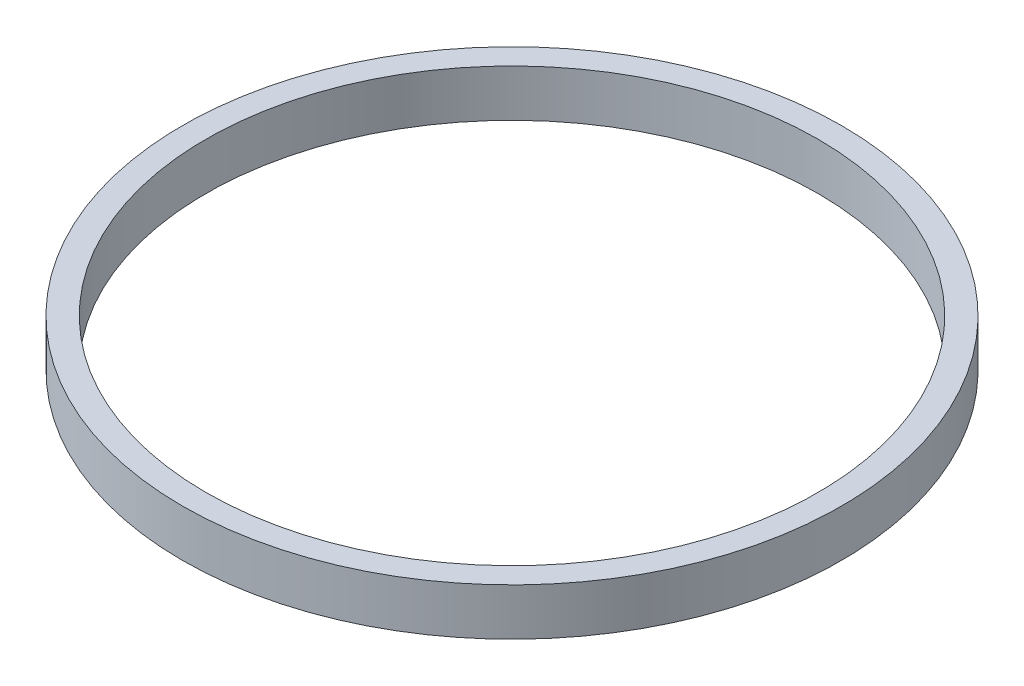
ISO-10303-21;
HEADER;
FILE_DESCRIPTION(('STEP AP214'),'2;1');
FILE_NAME('part.step','',(''),(''),'','','');
FILE_SCHEMA(('AUTOMOTIVE_DESIGN { 1 0 10303 214 1 1 1 1 }'));
ENDSEC;
DATA;
#1=APPLICATION_CONTEXT('core data for automotive mechanical design processes');
#2=APPLICATION_PROTOCOL_DEFINITION('international standard','automotive_design',2000,#1);
#3=PRODUCT_CONTEXT('',#1,'mechanical');
#4=PRODUCT('Part','Part','',(#3));
#5=PRODUCT_RELATED_PRODUCT_CATEGORY('part','',(#4));
#6=PRODUCT_DEFINITION_FORMATION('','',#4);
#7=PRODUCT_DEFINITION_CONTEXT('part definition',#1,'design');
#8=PRODUCT_DEFINITION('design','',#6,#7);
#9=PRODUCT_DEFINITION_SHAPE('','',#8);
#10=(LENGTH_UNIT() NAMED_UNIT(*) SI_UNIT(.MILLI.,.METRE.));
#11=(NAMED_UNIT(*) PLANE_ANGLE_UNIT() SI_UNIT($,.RADIAN.));
#12=(NAMED_UNIT(*) SI_UNIT($,.STERADIAN.) SOLID_ANGLE_UNIT());
#13=UNCERTAINTY_MEASURE_WITH_UNIT(LENGTH_MEASURE(1.E-05),#10,'distance_accuracy_value','');
#14=(GEOMETRIC_REPRESENTATION_CONTEXT(3) GLOBAL_UNCERTAINTY_ASSIGNED_CONTEXT((#13)) GLOBAL_UNIT_ASSIGNED_CONTEXT((#10,
#11,#12)) REPRESENTATION_CONTEXT('',''));
#15=CARTESIAN_POINT('',(0.,0.,0.));
#16=DIRECTION('',(0.,0.,1.));
#17=DIRECTION('',(1.,0.,0.));
#18=AXIS2_PLACEMENT_3D('',#15,#16,#17);
#19=CARTESIAN_POINT('',(0.,3.,0.));
#20=DIRECTION('',(0.,1.,0.));
#21=DIRECTION('',(0.,0.,1.));
#22=AXIS2_PLACEMENT_3D('',#19,#20,#21);
#23=PLANE('',#22);
#24=CARTESIAN_POINT('',(0.,3.,0.));
#25=DIRECTION('',(0.,1.,0.));
#26=DIRECTION('',(0.,0.,1.));
#27=AXIS2_PLACEMENT_3D('',#24,#25,#26);
#28=CIRCLE('',#27,21.);
#29=CARTESIAN_POINT('',(0.,3.,21.));
#30=VERTEX_POINT('',#29);
#31=EDGE_CURVE('E10',#30,#30,#28,.T.);
#32=ORIENTED_EDGE('',*,*,#31,.T.);
#33=EDGE_LOOP('',(#32));
#34=FACE_BOUND('',#33,.T.);
#35=CARTESIAN_POINT('',(0.,3.,0.));
#36=DIRECTION('',(0.,1.,0.));
#37=DIRECTION('',(0.,0.,1.));
#38=AXIS2_PLACEMENT_3D('',#35,#36,#37);
#39=CIRCLE('',#38,19.5);
#40=CARTESIAN_POINT('',(0.,3.,19.5));
#41=VERTEX_POINT('',#40);
#42=EDGE_CURVE('E44',#41,#41,#39,.T.);
#43=ORIENTED_EDGE('',*,*,#42,.F.);
#44=EDGE_LOOP('',(#43));
#45=FACE_BOUND('',#44,.T.);
#46=ADVANCED_FACE('F33',(#34,#45),#23,.T.);
#47=CARTESIAN_POINT('',(0.,0.,0.));
#48=DIRECTION('',(0.,1.,0.));
#49=DIRECTION('',(0.,0.,1.));
#50=AXIS2_PLACEMENT_3D('',#47,#48,#49);
#51=PLANE('',#50);
#52=CARTESIAN_POINT('',(0.,0.,0.));
#53=DIRECTION('',(0.,1.,0.));
#54=DIRECTION('',(0.,0.,1.));
#55=AXIS2_PLACEMENT_3D('',#52,#53,#54);
#56=CIRCLE('',#55,21.);
#57=CARTESIAN_POINT('',(0.,0.,21.));
#58=VERTEX_POINT('',#57);
#59=EDGE_CURVE('E37',#58,#58,#56,.T.);
#60=ORIENTED_EDGE('',*,*,#59,.F.);
#61=EDGE_LOOP('',(#60));
#62=FACE_BOUND('',#61,.T.);
#63=CARTESIAN_POINT('',(0.,0.,0.));
#64=DIRECTION('',(0.,1.,0.));
#65=DIRECTION('',(0.,0.,1.));
#66=AXIS2_PLACEMENT_3D('',#63,#64,#65);
#67=CIRCLE('',#66,19.5);
#68=CARTESIAN_POINT('',(0.,0.,19.5));
#69=VERTEX_POINT('',#68);
#70=EDGE_CURVE('E46',#69,#69,#67,.T.);
#71=ORIENTED_EDGE('',*,*,#70,.T.);
#72=EDGE_LOOP('',(#71));
#73=FACE_BOUND('',#72,.T.);
#74=ADVANCED_FACE('F56',(#62,#73),#51,.F.);
#75=CARTESIAN_POINT('',(0.,3.,0.));
#76=DIRECTION('',(0.,-1.,0.));
#77=DIRECTION('',(0.,0.,-1.));
#78=AXIS2_PLACEMENT_3D('',#75,#76,#77);
#79=CYLINDRICAL_SURFACE('',#78,21.);
#80=ORIENTED_EDGE('',*,*,#31,.F.);
#81=EDGE_LOOP('',(#80));
#82=FACE_BOUND('',#81,.T.);
#83=ORIENTED_EDGE('',*,*,#59,.T.);
#84=EDGE_LOOP('',(#83));
#85=FACE_BOUND('',#84,.T.);
#86=ADVANCED_FACE('F35',(#82,#85),#79,.T.);
#87=CARTESIAN_POINT('',(0.,3.,0.));
#88=DIRECTION('',(0.,-1.,0.));
#89=DIRECTION('',(0.,0.,-1.));
#90=AXIS2_PLACEMENT_3D('',#87,#88,#89);
#91=CYLINDRICAL_SURFACE('',#90,19.5);
#92=ORIENTED_EDGE('',*,*,#42,.T.);
#93=EDGE_LOOP('',(#92));
#94=FACE_BOUND('',#93,.T.);
#95=ORIENTED_EDGE('',*,*,#70,.F.);
#96=EDGE_LOOP('',(#95));
#97=FACE_BOUND('',#96,.T.);
#98=ADVANCED_FACE('F52',(#94,#97),#91,.F.);
#99=CLOSED_SHELL('',(#46,#74,#86,#98));
#100=MANIFOLD_SOLID_BREP('B2',#99);
#101=ADVANCED_BREP_SHAPE_REPRESENTATION('',(#18,#100),#14);
#102=SHAPE_DEFINITION_REPRESENTATION(#9,#101);
ENDSEC;
END-ISO-10303-21;
